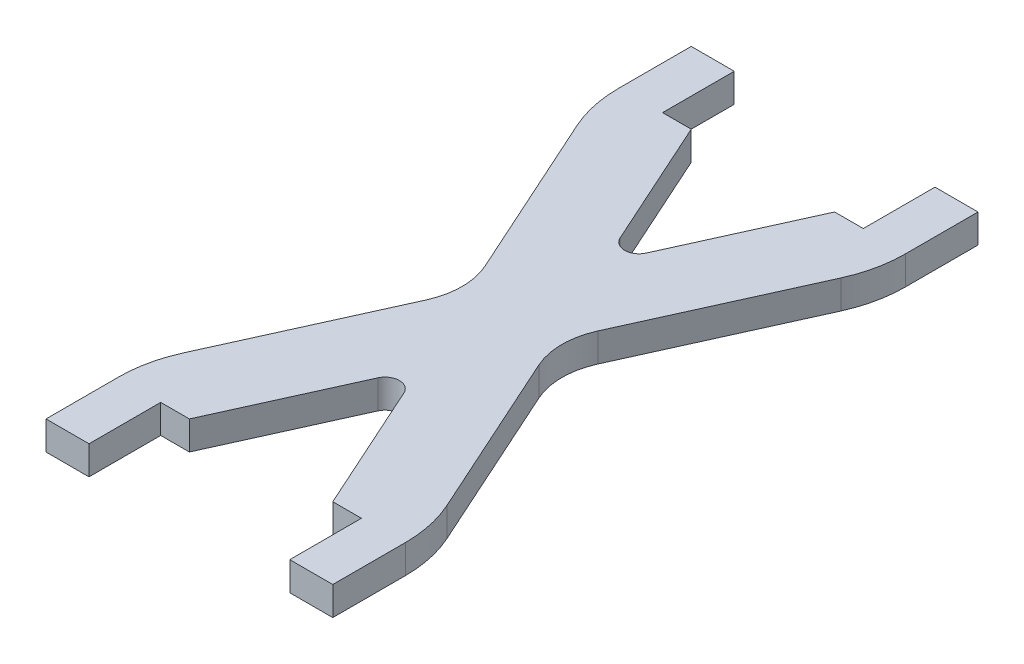
ISO-10303-21;
HEADER;
FILE_DESCRIPTION(('STEP AP214'),'2;1');
FILE_NAME('part.step','',(''),(''),'','','');
FILE_SCHEMA(('AUTOMOTIVE_DESIGN { 1 0 10303 214 1 1 1 1 }'));
ENDSEC;
DATA;
#1=APPLICATION_CONTEXT('core data for automotive mechanical design processes');
#2=APPLICATION_PROTOCOL_DEFINITION('international standard','automotive_design',2000,#1);
#3=PRODUCT_CONTEXT('',#1,'mechanical');
#4=PRODUCT('Part','Part','',(#3));
#5=PRODUCT_RELATED_PRODUCT_CATEGORY('part','',(#4));
#6=PRODUCT_DEFINITION_FORMATION('','',#4);
#7=PRODUCT_DEFINITION_CONTEXT('part definition',#1,'design');
#8=PRODUCT_DEFINITION('design','',#6,#7);
#9=PRODUCT_DEFINITION_SHAPE('','',#8);
#10=(LENGTH_UNIT() NAMED_UNIT(*) SI_UNIT(.MILLI.,.METRE.));
#11=(NAMED_UNIT(*) PLANE_ANGLE_UNIT() SI_UNIT($,.RADIAN.));
#12=(NAMED_UNIT(*) SI_UNIT($,.STERADIAN.) SOLID_ANGLE_UNIT());
#13=UNCERTAINTY_MEASURE_WITH_UNIT(LENGTH_MEASURE(1.E-05),#10,'distance_accuracy_value','');
#14=(GEOMETRIC_REPRESENTATION_CONTEXT(3) GLOBAL_UNCERTAINTY_ASSIGNED_CONTEXT((#13)) GLOBAL_UNIT_ASSIGNED_CONTEXT((#10,
#11,#12)) REPRESENTATION_CONTEXT('',''));
#15=CARTESIAN_POINT('',(0.,0.,0.));
#16=DIRECTION('',(0.,0.,1.));
#17=DIRECTION('',(1.,0.,0.));
#18=AXIS2_PLACEMENT_3D('',#15,#16,#17);
#19=CARTESIAN_POINT('',(0.,2.,5.));
#20=DIRECTION('',(0.,0.,-1.));
#21=DIRECTION('',(-1.,0.,0.));
#22=AXIS2_PLACEMENT_3D('',#19,#20,#21);
#23=PLANE('',#22);
#24=DIRECTION('',(1.,0.,0.));
#25=VECTOR('',#24,1.);
#26=CARTESIAN_POINT('',(0.,0.,5.));
#27=LINE('',#26,#25);
#28=CARTESIAN_POINT('',(0.,0.,5.));
#29=VERTEX_POINT('',#28);
#30=CARTESIAN_POINT('',(3.,0.,5.));
#31=VERTEX_POINT('',#30);
#32=EDGE_CURVE('E446',#29,#31,#27,.T.);
#33=ORIENTED_EDGE('',*,*,#32,.T.);
#34=DIRECTION('',(0.,-1.,0.));
#35=VECTOR('',#34,1.);
#36=CARTESIAN_POINT('',(3.,2.,5.));
#37=LINE('',#36,#35);
#38=CARTESIAN_POINT('',(3.,2.,5.));
#39=VERTEX_POINT('',#38);
#40=EDGE_CURVE('E259',#39,#31,#37,.T.);
#41=ORIENTED_EDGE('',*,*,#40,.F.);
#42=DIRECTION('',(1.,0.,0.));
#43=VECTOR('',#42,1.);
#44=CARTESIAN_POINT('',(0.,2.,5.));
#45=LINE('',#44,#43);
#46=CARTESIAN_POINT('',(0.,2.,5.));
#47=VERTEX_POINT('',#46);
#48=EDGE_CURVE('E245',#47,#39,#45,.T.);
#49=ORIENTED_EDGE('',*,*,#48,.F.);
#50=DIRECTION('',(0.,-1.,0.));
#51=VECTOR('',#50,1.);
#52=CARTESIAN_POINT('',(0.,2.,5.));
#53=LINE('',#52,#51);
#54=EDGE_CURVE('E257',#47,#29,#53,.T.);
#55=ORIENTED_EDGE('',*,*,#54,.T.);
#56=EDGE_LOOP('',(#33,#41,#49,#55));
#57=FACE_BOUND('',#56,.T.);
#58=ADVANCED_FACE('F33',(#57),#23,.F.);
#59=CARTESIAN_POINT('',(3.,2.,0.));
#60=DIRECTION('',(-1.,0.,0.));
#61=DIRECTION('',(0.,0.,1.));
#62=AXIS2_PLACEMENT_3D('',#59,#60,#61);
#63=PLANE('',#62);
#64=DIRECTION('',(0.,0.,-1.));
#65=VECTOR('',#64,1.);
#66=CARTESIAN_POINT('',(3.,0.,0.));
#67=LINE('',#66,#65);
#68=CARTESIAN_POINT('',(3.,0.,0.));
#69=VERTEX_POINT('',#68);
#70=EDGE_CURVE('E440',#31,#69,#67,.T.);
#71=ORIENTED_EDGE('',*,*,#70,.T.);
#72=DIRECTION('',(0.,-1.,0.));
#73=VECTOR('',#72,1.);
#74=CARTESIAN_POINT('',(3.,2.,0.));
#75=LINE('',#74,#73);
#76=CARTESIAN_POINT('',(3.,2.,0.));
#77=VERTEX_POINT('',#76);
#78=EDGE_CURVE('E271',#77,#69,#75,.T.);
#79=ORIENTED_EDGE('',*,*,#78,.F.);
#80=DIRECTION('',(0.,0.,-1.));
#81=VECTOR('',#80,1.);
#82=CARTESIAN_POINT('',(3.,2.,0.));
#83=LINE('',#82,#81);
#84=EDGE_CURVE('E261',#39,#77,#83,.T.);
#85=ORIENTED_EDGE('',*,*,#84,.F.);
#86=ORIENTED_EDGE('',*,*,#40,.T.);
#87=EDGE_LOOP('',(#71,#79,#85,#86));
#88=FACE_BOUND('',#87,.T.);
#89=ADVANCED_FACE('F501',(#88),#63,.F.);
#90=CARTESIAN_POINT('',(3.,2.,0.));
#91=DIRECTION('',(0.,0.,-1.));
#92=DIRECTION('',(-1.,0.,0.));
#93=AXIS2_PLACEMENT_3D('',#90,#91,#92);
#94=PLANE('',#93);
#95=DIRECTION('',(1.,0.,0.));
#96=VECTOR('',#95,1.);
#97=CARTESIAN_POINT('',(3.,0.,0.));
#98=LINE('',#97,#96);
#99=CARTESIAN_POINT('',(5.,0.,0.));
#100=VERTEX_POINT('',#99);
#101=EDGE_CURVE('E435',#69,#100,#98,.T.);
#102=ORIENTED_EDGE('',*,*,#101,.T.);
#103=DIRECTION('',(0.,-1.,0.));
#104=VECTOR('',#103,1.);
#105=CARTESIAN_POINT('',(5.,2.,0.));
#106=LINE('',#105,#104);
#107=CARTESIAN_POINT('',(5.,2.,0.));
#108=VERTEX_POINT('',#107);
#109=EDGE_CURVE('E426',#108,#100,#106,.T.);
#110=ORIENTED_EDGE('',*,*,#109,.F.);
#111=DIRECTION('',(1.,0.,0.));
#112=VECTOR('',#111,1.);
#113=CARTESIAN_POINT('',(3.,2.,0.));
#114=LINE('',#113,#112);
#115=EDGE_CURVE('E436',#77,#108,#114,.T.);
#116=ORIENTED_EDGE('',*,*,#115,.F.);
#117=ORIENTED_EDGE('',*,*,#78,.T.);
#118=EDGE_LOOP('',(#102,#110,#116,#117));
#119=FACE_BOUND('',#118,.T.);
#120=ADVANCED_FACE('F433',(#119),#94,.F.);
#121=CARTESIAN_POINT('',(5.,2.,0.));
#122=DIRECTION('',(-0.911370599658675,0.,-0.411586722426499));
#123=DIRECTION('',(-0.411586722426499,0.,0.911370599658675));
#124=AXIS2_PLACEMENT_3D('',#121,#122,#123);
#125=PLANE('',#124);
#126=DIRECTION('',(0.411586722426499,0.,-0.911370599658675));
#127=VECTOR('',#126,1.);
#128=CARTESIAN_POINT('',(5.,0.,0.));
#129=LINE('',#128,#127);
#130=CARTESIAN_POINT('',(9.08862940034133,0.,-9.05339367218436));
#131=VERTEX_POINT('',#130);
#132=EDGE_CURVE('E442',#100,#131,#129,.T.);
#133=ORIENTED_EDGE('',*,*,#132,.T.);
#134=DIRECTION('',(0.,-1.,0.));
#135=VECTOR('',#134,1.);
#136=CARTESIAN_POINT('',(9.08862940034133,2.,-9.05339367218436));
#137=LINE('',#136,#135);
#138=CARTESIAN_POINT('',(9.08862940034133,2.,-9.05339367218436));
#139=VERTEX_POINT('',#138);
#140=EDGE_CURVE('E269',#131,#139,#137,.F.);
#141=ORIENTED_EDGE('',*,*,#140,.T.);
#142=DIRECTION('',(0.411586722426499,0.,-0.911370599658675));
#143=VECTOR('',#142,1.);
#144=CARTESIAN_POINT('',(5.,2.,0.));
#145=LINE('',#144,#143);
#146=EDGE_CURVE('E503',#108,#139,#145,.T.);
#147=ORIENTED_EDGE('',*,*,#146,.F.);
#148=ORIENTED_EDGE('',*,*,#109,.T.);
#149=EDGE_LOOP('',(#133,#141,#147,#148));
#150=FACE_BOUND('',#149,.T.);
#151=ADVANCED_FACE('F530',(#150),#125,.F.);
#152=CARTESIAN_POINT('',(15.,2.,0.));
#153=DIRECTION('',(0.911370599658675,0.,-0.411586722426499));
#154=DIRECTION('',(-0.411586722426499,0.,-0.911370599658675));
#155=AXIS2_PLACEMENT_3D('',#152,#153,#154);
#156=PLANE('',#155);
#157=DIRECTION('',(0.411586722426499,0.,0.911370599658675));
#158=VECTOR('',#157,1.);
#159=CARTESIAN_POINT('',(15.,2.,0.));
#160=LINE('',#159,#158);
#161=CARTESIAN_POINT('',(10.9113705996587,2.,-9.05339367218436));
#162=VERTEX_POINT('',#161);
#163=CARTESIAN_POINT('',(15.,2.,0.));
#164=VERTEX_POINT('',#163);
#165=EDGE_CURVE('E508',#162,#164,#160,.T.);
#166=ORIENTED_EDGE('',*,*,#165,.F.);
#167=DIRECTION('',(0.,-1.,0.));
#168=VECTOR('',#167,1.);
#169=CARTESIAN_POINT('',(10.9113705996587,0.,-9.05339367218436));
#170=LINE('',#169,#168);
#171=CARTESIAN_POINT('',(10.9113705996587,0.,-9.05339367218436));
#172=VERTEX_POINT('',#171);
#173=EDGE_CURVE('E266',#162,#172,#170,.T.);
#174=ORIENTED_EDGE('',*,*,#173,.T.);
#175=DIRECTION('',(0.411586722426499,0.,0.911370599658675));
#176=VECTOR('',#175,1.);
#177=CARTESIAN_POINT('',(15.,0.,0.));
#178=LINE('',#177,#176);
#179=CARTESIAN_POINT('',(15.,0.,0.));
#180=VERTEX_POINT('',#179);
#181=EDGE_CURVE('E444',#172,#180,#178,.T.);
#182=ORIENTED_EDGE('',*,*,#181,.T.);
#183=DIRECTION('',(0.,-1.,0.));
#184=VECTOR('',#183,1.);
#185=CARTESIAN_POINT('',(15.,2.,0.));
#186=LINE('',#185,#184);
#187=EDGE_CURVE('E423',#164,#180,#186,.T.);
#188=ORIENTED_EDGE('',*,*,#187,.F.);
#189=EDGE_LOOP('',(#166,#174,#182,#188));
#190=FACE_BOUND('',#189,.T.);
#191=ADVANCED_FACE('F523',(#190),#156,.F.);
#192=CARTESIAN_POINT('',(15.,2.,0.));
#193=DIRECTION('',(0.,0.,-1.));
#194=DIRECTION('',(-1.,0.,0.));
#195=AXIS2_PLACEMENT_3D('',#192,#193,#194);
#196=PLANE('',#195);
#197=DIRECTION('',(1.,0.,0.));
#198=VECTOR('',#197,1.);
#199=CARTESIAN_POINT('',(15.,0.,0.));
#200=LINE('',#199,#198);
#201=CARTESIAN_POINT('',(17.,0.,0.));
#202=VERTEX_POINT('',#201);
#203=EDGE_CURVE('E451',#180,#202,#200,.T.);
#204=ORIENTED_EDGE('',*,*,#203,.T.);
#205=DIRECTION('',(0.,-1.,0.));
#206=VECTOR('',#205,1.);
#207=CARTESIAN_POINT('',(17.,2.,0.));
#208=LINE('',#207,#206);
#209=CARTESIAN_POINT('',(17.,2.,0.));
#210=VERTEX_POINT('',#209);
#211=EDGE_CURVE('E420',#210,#202,#208,.T.);
#212=ORIENTED_EDGE('',*,*,#211,.F.);
#213=DIRECTION('',(1.,0.,0.));
#214=VECTOR('',#213,1.);
#215=CARTESIAN_POINT('',(15.,2.,0.));
#216=LINE('',#215,#214);
#217=EDGE_CURVE('E510',#164,#210,#216,.T.);
#218=ORIENTED_EDGE('',*,*,#217,.F.);
#219=ORIENTED_EDGE('',*,*,#187,.T.);
#220=EDGE_LOOP('',(#204,#212,#218,#219));
#221=FACE_BOUND('',#220,.T.);
#222=ADVANCED_FACE('F519',(#221),#196,.F.);
#223=CARTESIAN_POINT('',(17.,2.,0.));
#224=DIRECTION('',(1.,0.,0.));
#225=DIRECTION('',(0.,0.,-1.));
#226=AXIS2_PLACEMENT_3D('',#223,#224,#225);
#227=PLANE('',#226);
#228=DIRECTION('',(0.,0.,1.));
#229=VECTOR('',#228,1.);
#230=CARTESIAN_POINT('',(17.,0.,0.));
#231=LINE('',#230,#229);
#232=CARTESIAN_POINT('',(17.,0.,5.));
#233=VERTEX_POINT('',#232);
#234=EDGE_CURVE('E453',#202,#233,#231,.T.);
#235=ORIENTED_EDGE('',*,*,#234,.T.);
#236=DIRECTION('',(0.,-1.,0.));
#237=VECTOR('',#236,1.);
#238=CARTESIAN_POINT('',(17.,2.,5.));
#239=LINE('',#238,#237);
#240=CARTESIAN_POINT('',(17.,2.,5.));
#241=VERTEX_POINT('',#240);
#242=EDGE_CURVE('E417',#241,#233,#239,.T.);
#243=ORIENTED_EDGE('',*,*,#242,.F.);
#244=DIRECTION('',(0.,0.,1.));
#245=VECTOR('',#244,1.);
#246=CARTESIAN_POINT('',(17.,2.,0.));
#247=LINE('',#246,#245);
#248=EDGE_CURVE('E472',#210,#241,#247,.T.);
#249=ORIENTED_EDGE('',*,*,#248,.F.);
#250=ORIENTED_EDGE('',*,*,#211,.T.);
#251=EDGE_LOOP('',(#235,#243,#249,#250));
#252=FACE_BOUND('',#251,.T.);
#253=ADVANCED_FACE('F515',(#252),#227,.F.);
#254=CARTESIAN_POINT('',(20.,2.,5.));
#255=DIRECTION('',(0.,0.,-1.));
#256=DIRECTION('',(-1.,0.,0.));
#257=AXIS2_PLACEMENT_3D('',#254,#255,#256);
#258=PLANE('',#257);
#259=DIRECTION('',(1.,0.,0.));
#260=VECTOR('',#259,1.);
#261=CARTESIAN_POINT('',(20.,0.,5.));
#262=LINE('',#261,#260);
#263=CARTESIAN_POINT('',(20.,0.,5.));
#264=VERTEX_POINT('',#263);
#265=EDGE_CURVE('E358',#233,#264,#262,.T.);
#266=ORIENTED_EDGE('',*,*,#265,.T.);
#267=DIRECTION('',(0.,-1.,0.));
#268=VECTOR('',#267,1.);
#269=CARTESIAN_POINT('',(20.,2.,5.));
#270=LINE('',#269,#268);
#271=CARTESIAN_POINT('',(20.,2.,5.));
#272=VERTEX_POINT('',#271);
#273=EDGE_CURVE('E414',#272,#264,#270,.T.);
#274=ORIENTED_EDGE('',*,*,#273,.F.);
#275=DIRECTION('',(1.,0.,0.));
#276=VECTOR('',#275,1.);
#277=CARTESIAN_POINT('',(20.,2.,5.));
#278=LINE('',#277,#276);
#279=EDGE_CURVE('E468',#241,#272,#278,.T.);
#280=ORIENTED_EDGE('',*,*,#279,.F.);
#281=ORIENTED_EDGE('',*,*,#242,.T.);
#282=EDGE_LOOP('',(#266,#274,#280,#281));
#283=FACE_BOUND('',#282,.T.);
#284=ADVANCED_FACE('F458',(#283),#258,.F.);
#285=CARTESIAN_POINT('',(20.,2.,0.));
#286=DIRECTION('',(-1.,0.,0.));
#287=DIRECTION('',(0.,0.,1.));
#288=AXIS2_PLACEMENT_3D('',#285,#286,#287);
#289=PLANE('',#288);
#290=DIRECTION('',(0.,0.,-1.));
#291=VECTOR('',#290,1.);
#292=CARTESIAN_POINT('',(20.,0.,0.));
#293=LINE('',#292,#291);
#294=CARTESIAN_POINT('',(20.,0.,-0.0619768335350678));
#295=VERTEX_POINT('',#294);
#296=EDGE_CURVE('E353',#264,#295,#293,.T.);
#297=ORIENTED_EDGE('',*,*,#296,.T.);
#298=DIRECTION('',(0.,-1.,0.));
#299=VECTOR('',#298,1.);
#300=CARTESIAN_POINT('',(20.,2.,-0.0619768335350678));
#301=LINE('',#300,#299);
#302=CARTESIAN_POINT('',(20.,2.,-0.0619768335350678));
#303=VERTEX_POINT('',#302);
#304=EDGE_CURVE('E11',#295,#303,#301,.F.);
#305=ORIENTED_EDGE('',*,*,#304,.T.);
#306=DIRECTION('',(0.,0.,-1.));
#307=VECTOR('',#306,1.);
#308=CARTESIAN_POINT('',(20.,2.,0.));
#309=LINE('',#308,#307);
#310=EDGE_CURVE('E467',#272,#303,#309,.T.);
#311=ORIENTED_EDGE('',*,*,#310,.F.);
#312=ORIENTED_EDGE('',*,*,#273,.T.);
#313=EDGE_LOOP('',(#297,#305,#311,#312));
#314=FACE_BOUND('',#313,.T.);
#315=ADVANCED_FACE('F464',(#314),#289,.F.);
#316=CARTESIAN_POINT('',(20.,2.,-2.));
#317=DIRECTION('',(-0.911370599658675,0.,0.411586722426498));
#318=DIRECTION('',(0.411586722426498,0.,0.911370599658675));
#319=AXIS2_PLACEMENT_3D('',#316,#317,#318);
#320=PLANE('',#319);
#321=DIRECTION('',(-0.411586722426498,0.,-0.911370599658675));
#322=VECTOR('',#321,1.);
#323=CARTESIAN_POINT('',(20.,2.,-2.));
#324=LINE('',#323,#322);
#325=CARTESIAN_POINT('',(19.2023353969281,2.,-3.76625733537355));
#326=VERTEX_POINT('',#325);
#327=CARTESIAN_POINT('',(13.9293893732211,2.,-15.4420663878675));
#328=VERTEX_POINT('',#327);
#329=EDGE_CURVE('E344',#326,#328,#324,.T.);
#330=ORIENTED_EDGE('',*,*,#329,.F.);
#331=DIRECTION('',(0.,-1.,0.));
#332=VECTOR('',#331,1.);
#333=CARTESIAN_POINT('',(19.2023353969281,2.,-3.76625733537355));
#334=LINE('',#333,#332);
#335=CARTESIAN_POINT('',(19.2023353969281,0.,-3.76625733537355));
#336=VERTEX_POINT('',#335);
#337=EDGE_CURVE('E41',#326,#336,#334,.T.);
#338=ORIENTED_EDGE('',*,*,#337,.T.);
#339=DIRECTION('',(-0.411586722426498,0.,-0.911370599658675));
#340=VECTOR('',#339,1.);
#341=CARTESIAN_POINT('',(20.,0.,-2.));
#342=LINE('',#341,#340);
#343=CARTESIAN_POINT('',(13.9293893732211,0.,-15.4420663878675));
#344=VERTEX_POINT('',#343);
#345=EDGE_CURVE('E343',#336,#344,#342,.T.);
#346=ORIENTED_EDGE('',*,*,#345,.T.);
#347=DIRECTION('',(0.,-1.,0.));
#348=VECTOR('',#347,1.);
#349=CARTESIAN_POINT('',(13.9293893732211,2.,-15.4420663878675));
#350=LINE('',#349,#348);
#351=EDGE_CURVE('E298',#344,#328,#350,.F.);
#352=ORIENTED_EDGE('',*,*,#351,.T.);
#353=EDGE_LOOP('',(#330,#338,#346,#352));
#354=FACE_BOUND('',#353,.T.);
#355=ADVANCED_FACE('F342',(#354),#320,.F.);
#356=CARTESIAN_POINT('',(20.,2.,-33.));
#357=DIRECTION('',(-0.911370599658675,0.,-0.411586722426498));
#358=DIRECTION('',(-0.411586722426498,0.,0.911370599658675));
#359=AXIS2_PLACEMENT_3D('',#356,#357,#358);
#360=PLANE('',#359);
#361=DIRECTION('',(0.411586722426498,0.,-0.911370599658675));
#362=VECTOR('',#361,1.);
#363=CARTESIAN_POINT('',(20.,0.,-33.));
#364=LINE('',#363,#362);
#365=CARTESIAN_POINT('',(13.9293893732211,0.,-19.5579336121325));
#366=VERTEX_POINT('',#365);
#367=CARTESIAN_POINT('',(19.2023353969281,0.,-31.2337426646264));
#368=VERTEX_POINT('',#367);
#369=EDGE_CURVE('E352',#366,#368,#364,.T.);
#370=ORIENTED_EDGE('',*,*,#369,.T.);
#371=DIRECTION('',(0.,-1.,0.));
#372=VECTOR('',#371,1.);
#373=CARTESIAN_POINT('',(19.2023353969281,2.,-31.2337426646264));
#374=LINE('',#373,#372);
#375=CARTESIAN_POINT('',(19.2023353969281,2.,-31.2337426646264));
#376=VERTEX_POINT('',#375);
#377=EDGE_CURVE('E336',#368,#376,#374,.F.);
#378=ORIENTED_EDGE('',*,*,#377,.T.);
#379=DIRECTION('',(0.411586722426498,0.,-0.911370599658675));
#380=VECTOR('',#379,1.);
#381=CARTESIAN_POINT('',(20.,2.,-33.));
#382=LINE('',#381,#380);
#383=CARTESIAN_POINT('',(13.9293893732211,2.,-19.5579336121325));
#384=VERTEX_POINT('',#383);
#385=EDGE_CURVE('E470',#384,#376,#382,.T.);
#386=ORIENTED_EDGE('',*,*,#385,.F.);
#387=DIRECTION('',(0.,-1.,0.));
#388=VECTOR('',#387,1.);
#389=CARTESIAN_POINT('',(13.9293893732211,0.,-19.5579336121325));
#390=LINE('',#389,#388);
#391=EDGE_CURVE('E295',#384,#366,#390,.T.);
#392=ORIENTED_EDGE('',*,*,#391,.T.);
#393=EDGE_LOOP('',(#370,#378,#386,#392));
#394=FACE_BOUND('',#393,.T.);
#395=ADVANCED_FACE('F655',(#394),#360,.F.);
#396=CARTESIAN_POINT('',(20.,2.,-35.));
#397=DIRECTION('',(-1.,0.,0.));
#398=DIRECTION('',(0.,0.,1.));
#399=AXIS2_PLACEMENT_3D('',#396,#397,#398);
#400=PLANE('',#399);
#401=DIRECTION('',(0.,0.,-1.));
#402=VECTOR('',#401,1.);
#403=CARTESIAN_POINT('',(20.,2.,-33.));
#404=LINE('',#403,#402);
#405=CARTESIAN_POINT('',(20.,2.,-34.9380231664649));
#406=VERTEX_POINT('',#405);
#407=CARTESIAN_POINT('',(20.,2.,-40.));
#408=VERTEX_POINT('',#407);
#409=EDGE_CURVE('E478',#406,#408,#404,.T.);
#410=ORIENTED_EDGE('',*,*,#409,.F.);
#411=DIRECTION('',(0.,-1.,0.));
#412=VECTOR('',#411,1.);
#413=CARTESIAN_POINT('',(20.,2.,-34.9380231664649));
#414=LINE('',#413,#412);
#415=CARTESIAN_POINT('',(20.,0.,-34.9380231664649));
#416=VERTEX_POINT('',#415);
#417=EDGE_CURVE('E333',#406,#416,#414,.T.);
#418=ORIENTED_EDGE('',*,*,#417,.T.);
#419=DIRECTION('',(0.,0.,-1.));
#420=VECTOR('',#419,1.);
#421=CARTESIAN_POINT('',(20.,0.,-35.));
#422=LINE('',#421,#420);
#423=CARTESIAN_POINT('',(20.,0.,-40.));
#424=VERTEX_POINT('',#423);
#425=EDGE_CURVE('E356',#416,#424,#422,.T.);
#426=ORIENTED_EDGE('',*,*,#425,.T.);
#427=DIRECTION('',(0.,-1.,0.));
#428=VECTOR('',#427,1.);
#429=CARTESIAN_POINT('',(20.,2.,-40.));
#430=LINE('',#429,#428);
#431=EDGE_CURVE('E411',#408,#424,#430,.T.);
#432=ORIENTED_EDGE('',*,*,#431,.F.);
#433=EDGE_LOOP('',(#410,#418,#426,#432));
#434=FACE_BOUND('',#433,.T.);
#435=ADVANCED_FACE('F581',(#434),#400,.F.);
#436=CARTESIAN_POINT('',(20.,2.,-40.));
#437=DIRECTION('',(0.,0.,1.));
#438=DIRECTION('',(1.,0.,0.));
#439=AXIS2_PLACEMENT_3D('',#436,#437,#438);
#440=PLANE('',#439);
#441=DIRECTION('',(-1.,0.,0.));
#442=VECTOR('',#441,1.);
#443=CARTESIAN_POINT('',(20.,0.,-40.));
#444=LINE('',#443,#442);
#445=CARTESIAN_POINT('',(17.,0.,-40.));
#446=VERTEX_POINT('',#445);
#447=EDGE_CURVE('E363',#424,#446,#444,.T.);
#448=ORIENTED_EDGE('',*,*,#447,.T.);
#449=DIRECTION('',(0.,-1.,0.));
#450=VECTOR('',#449,1.);
#451=CARTESIAN_POINT('',(17.,2.,-40.));
#452=LINE('',#451,#450);
#453=CARTESIAN_POINT('',(17.,2.,-40.));
#454=VERTEX_POINT('',#453);
#455=EDGE_CURVE('E408',#454,#446,#452,.T.);
#456=ORIENTED_EDGE('',*,*,#455,.F.);
#457=DIRECTION('',(-1.,0.,0.));
#458=VECTOR('',#457,1.);
#459=CARTESIAN_POINT('',(20.,2.,-40.));
#460=LINE('',#459,#458);
#461=EDGE_CURVE('E480',#408,#454,#460,.T.);
#462=ORIENTED_EDGE('',*,*,#461,.F.);
#463=ORIENTED_EDGE('',*,*,#431,.T.);
#464=EDGE_LOOP('',(#448,#456,#462,#463));
#465=FACE_BOUND('',#464,.T.);
#466=ADVANCED_FACE('F587',(#465),#440,.F.);
#467=CARTESIAN_POINT('',(17.,2.,-35.));
#468=DIRECTION('',(1.,0.,0.));
#469=DIRECTION('',(0.,0.,-1.));
#470=AXIS2_PLACEMENT_3D('',#467,#468,#469);
#471=PLANE('',#470);
#472=DIRECTION('',(0.,0.,1.));
#473=VECTOR('',#472,1.);
#474=CARTESIAN_POINT('',(17.,0.,-35.));
#475=LINE('',#474,#473);
#476=CARTESIAN_POINT('',(17.,0.,-35.));
#477=VERTEX_POINT('',#476);
#478=EDGE_CURVE('E365',#446,#477,#475,.T.);
#479=ORIENTED_EDGE('',*,*,#478,.T.);
#480=DIRECTION('',(0.,-1.,0.));
#481=VECTOR('',#480,1.);
#482=CARTESIAN_POINT('',(17.,2.,-35.));
#483=LINE('',#482,#481);
#484=CARTESIAN_POINT('',(17.,2.,-35.));
#485=VERTEX_POINT('',#484);
#486=EDGE_CURVE('E405',#485,#477,#483,.T.);
#487=ORIENTED_EDGE('',*,*,#486,.F.);
#488=DIRECTION('',(0.,0.,1.));
#489=VECTOR('',#488,1.);
#490=CARTESIAN_POINT('',(17.,2.,-35.));
#491=LINE('',#490,#489);
#492=EDGE_CURVE('E482',#454,#485,#491,.T.);
#493=ORIENTED_EDGE('',*,*,#492,.F.);
#494=ORIENTED_EDGE('',*,*,#455,.T.);
#495=EDGE_LOOP('',(#479,#487,#493,#494));
#496=FACE_BOUND('',#495,.T.);
#497=ADVANCED_FACE('F593',(#496),#471,.F.);
#498=CARTESIAN_POINT('',(15.,2.,-35.));
#499=DIRECTION('',(0.,0.,1.));
#500=DIRECTION('',(1.,0.,0.));
#501=AXIS2_PLACEMENT_3D('',#498,#499,#500);
#502=PLANE('',#501);
#503=DIRECTION('',(-1.,0.,0.));
#504=VECTOR('',#503,1.);
#505=CARTESIAN_POINT('',(15.,0.,-35.));
#506=LINE('',#505,#504);
#507=CARTESIAN_POINT('',(15.,0.,-35.));
#508=VERTEX_POINT('',#507);
#509=EDGE_CURVE('E367',#477,#508,#506,.T.);
#510=ORIENTED_EDGE('',*,*,#509,.T.);
#511=DIRECTION('',(0.,-1.,0.));
#512=VECTOR('',#511,1.);
#513=CARTESIAN_POINT('',(15.,2.,-35.));
#514=LINE('',#513,#512);
#515=CARTESIAN_POINT('',(15.,2.,-35.));
#516=VERTEX_POINT('',#515);
#517=EDGE_CURVE('E402',#516,#508,#514,.T.);
#518=ORIENTED_EDGE('',*,*,#517,.F.);
#519=DIRECTION('',(-1.,0.,0.));
#520=VECTOR('',#519,1.);
#521=CARTESIAN_POINT('',(15.,2.,-35.));
#522=LINE('',#521,#520);
#523=EDGE_CURVE('E484',#485,#516,#522,.T.);
#524=ORIENTED_EDGE('',*,*,#523,.F.);
#525=ORIENTED_EDGE('',*,*,#486,.T.);
#526=EDGE_LOOP('',(#510,#518,#524,#525));
#527=FACE_BOUND('',#526,.T.);
#528=ADVANCED_FACE('F597',(#527),#502,.F.);
#529=CARTESIAN_POINT('',(15.,2.,-35.));
#530=DIRECTION('',(0.911370599658675,0.,0.411586722426499));
#531=DIRECTION('',(0.411586722426499,0.,-0.911370599658675));
#532=AXIS2_PLACEMENT_3D('',#529,#530,#531);
#533=PLANE('',#532);
#534=DIRECTION('',(-0.411586722426499,0.,0.911370599658675));
#535=VECTOR('',#534,1.);
#536=CARTESIAN_POINT('',(15.,0.,-35.));
#537=LINE('',#536,#535);
#538=CARTESIAN_POINT('',(10.9113705996587,0.,-25.9466063278156));
#539=VERTEX_POINT('',#538);
#540=EDGE_CURVE('E369',#508,#539,#537,.T.);
#541=ORIENTED_EDGE('',*,*,#540,.T.);
#542=DIRECTION('',(0.,-1.,0.));
#543=VECTOR('',#542,1.);
#544=CARTESIAN_POINT('',(10.9113705996587,2.,-25.9466063278156));
#545=LINE('',#544,#543);
#546=CARTESIAN_POINT('',(10.9113705996587,2.,-25.9466063278156));
#547=VERTEX_POINT('',#546);
#548=EDGE_CURVE('E279',#539,#547,#545,.F.);
#549=ORIENTED_EDGE('',*,*,#548,.T.);
#550=DIRECTION('',(-0.411586722426499,0.,0.911370599658675));
#551=VECTOR('',#550,1.);
#552=CARTESIAN_POINT('',(15.,2.,-35.));
#553=LINE('',#552,#551);
#554=EDGE_CURVE('E486',#516,#547,#553,.T.);
#555=ORIENTED_EDGE('',*,*,#554,.F.);
#556=ORIENTED_EDGE('',*,*,#517,.T.);
#557=EDGE_LOOP('',(#541,#549,#555,#556));
#558=FACE_BOUND('',#557,.T.);
#559=ADVANCED_FACE('F601',(#558),#533,.F.);
#560=CARTESIAN_POINT('',(5.,2.,-35.));
#561=DIRECTION('',(-0.911370599658675,0.,0.411586722426499));
#562=DIRECTION('',(0.411586722426499,0.,0.911370599658675));
#563=AXIS2_PLACEMENT_3D('',#560,#561,#562);
#564=PLANE('',#563);
#565=DIRECTION('',(-0.411586722426499,0.,-0.911370599658675));
#566=VECTOR('',#565,1.);
#567=CARTESIAN_POINT('',(5.,2.,-35.));
#568=LINE('',#567,#566);
#569=CARTESIAN_POINT('',(9.08862940034133,2.,-25.9466063278156));
#570=VERTEX_POINT('',#569);
#571=CARTESIAN_POINT('',(5.,2.,-35.));
#572=VERTEX_POINT('',#571);
#573=EDGE_CURVE('E489',#570,#572,#568,.T.);
#574=ORIENTED_EDGE('',*,*,#573,.F.);
#575=DIRECTION('',(0.,-1.,0.));
#576=VECTOR('',#575,1.);
#577=CARTESIAN_POINT('',(9.08862940034132,0.,-25.9466063278156));
#578=LINE('',#577,#576);
#579=CARTESIAN_POINT('',(9.08862940034133,0.,-25.9466063278156));
#580=VERTEX_POINT('',#579);
#581=EDGE_CURVE('E276',#570,#580,#578,.T.);
#582=ORIENTED_EDGE('',*,*,#581,.T.);
#583=DIRECTION('',(-0.411586722426499,0.,-0.911370599658675));
#584=VECTOR('',#583,1.);
#585=CARTESIAN_POINT('',(5.,0.,-35.));
#586=LINE('',#585,#584);
#587=CARTESIAN_POINT('',(5.,0.,-35.));
#588=VERTEX_POINT('',#587);
#589=EDGE_CURVE('E372',#580,#588,#586,.T.);
#590=ORIENTED_EDGE('',*,*,#589,.T.);
#591=DIRECTION('',(0.,-1.,0.));
#592=VECTOR('',#591,1.);
#593=CARTESIAN_POINT('',(5.,2.,-35.));
#594=LINE('',#593,#592);
#595=EDGE_CURVE('E399',#572,#588,#594,.T.);
#596=ORIENTED_EDGE('',*,*,#595,.F.);
#597=EDGE_LOOP('',(#574,#582,#590,#596));
#598=FACE_BOUND('',#597,.T.);
#599=ADVANCED_FACE('F608',(#598),#564,.F.);
#600=CARTESIAN_POINT('',(3.,2.,-35.));
#601=DIRECTION('',(0.,0.,1.));
#602=DIRECTION('',(1.,0.,0.));
#603=AXIS2_PLACEMENT_3D('',#600,#601,#602);
#604=PLANE('',#603);
#605=DIRECTION('',(-1.,0.,0.));
#606=VECTOR('',#605,1.);
#607=CARTESIAN_POINT('',(3.,0.,-35.));
#608=LINE('',#607,#606);
#609=CARTESIAN_POINT('',(3.,0.,-35.));
#610=VERTEX_POINT('',#609);
#611=EDGE_CURVE('E374',#588,#610,#608,.T.);
#612=ORIENTED_EDGE('',*,*,#611,.T.);
#613=DIRECTION('',(0.,-1.,0.));
#614=VECTOR('',#613,1.);
#615=CARTESIAN_POINT('',(3.,2.,-35.));
#616=LINE('',#615,#614);
#617=CARTESIAN_POINT('',(3.,2.,-35.));
#618=VERTEX_POINT('',#617);
#619=EDGE_CURVE('E396',#618,#610,#616,.T.);
#620=ORIENTED_EDGE('',*,*,#619,.F.);
#621=DIRECTION('',(-1.,0.,0.));
#622=VECTOR('',#621,1.);
#623=CARTESIAN_POINT('',(3.,2.,-35.));
#624=LINE('',#623,#622);
#625=EDGE_CURVE('E491',#572,#618,#624,.T.);
#626=ORIENTED_EDGE('',*,*,#625,.F.);
#627=ORIENTED_EDGE('',*,*,#595,.T.);
#628=EDGE_LOOP('',(#612,#620,#626,#627));
#629=FACE_BOUND('',#628,.T.);
#630=ADVANCED_FACE('F615',(#629),#604,.F.);
#631=CARTESIAN_POINT('',(3.,2.,-35.));
#632=DIRECTION('',(-1.,0.,0.));
#633=DIRECTION('',(0.,0.,1.));
#634=AXIS2_PLACEMENT_3D('',#631,#632,#633);
#635=PLANE('',#634);
#636=DIRECTION('',(0.,0.,-1.));
#637=VECTOR('',#636,1.);
#638=CARTESIAN_POINT('',(3.,0.,-35.));
#639=LINE('',#638,#637);
#640=CARTESIAN_POINT('',(3.,0.,-40.));
#641=VERTEX_POINT('',#640);
#642=EDGE_CURVE('E376',#610,#641,#639,.T.);
#643=ORIENTED_EDGE('',*,*,#642,.T.);
#644=DIRECTION('',(0.,-1.,0.));
#645=VECTOR('',#644,1.);
#646=CARTESIAN_POINT('',(3.,2.,-40.));
#647=LINE('',#646,#645);
#648=CARTESIAN_POINT('',(3.,2.,-40.));
#649=VERTEX_POINT('',#648);
#650=EDGE_CURVE('E392',#649,#641,#647,.T.);
#651=ORIENTED_EDGE('',*,*,#650,.F.);
#652=DIRECTION('',(0.,0.,-1.));
#653=VECTOR('',#652,1.);
#654=CARTESIAN_POINT('',(3.,2.,-35.));
#655=LINE('',#654,#653);
#656=EDGE_CURVE('E493',#618,#649,#655,.T.);
#657=ORIENTED_EDGE('',*,*,#656,.F.);
#658=ORIENTED_EDGE('',*,*,#619,.T.);
#659=EDGE_LOOP('',(#643,#651,#657,#658));
#660=FACE_BOUND('',#659,.T.);
#661=ADVANCED_FACE('F619',(#660),#635,.F.);
#662=CARTESIAN_POINT('',(0.,2.,-40.));
#663=DIRECTION('',(0.,0.,1.));
#664=DIRECTION('',(1.,0.,0.));
#665=AXIS2_PLACEMENT_3D('',#662,#663,#664);
#666=PLANE('',#665);
#667=DIRECTION('',(-1.,0.,0.));
#668=VECTOR('',#667,1.);
#669=CARTESIAN_POINT('',(0.,0.,-40.));
#670=LINE('',#669,#668);
#671=CARTESIAN_POINT('',(0.,0.,-40.));
#672=VERTEX_POINT('',#671);
#673=EDGE_CURVE('E378',#641,#672,#670,.T.);
#674=ORIENTED_EDGE('',*,*,#673,.T.);
#675=DIRECTION('',(0.,-1.,0.));
#676=VECTOR('',#675,1.);
#677=CARTESIAN_POINT('',(0.,2.,-40.));
#678=LINE('',#677,#676);
#679=CARTESIAN_POINT('',(0.,2.,-40.));
#680=VERTEX_POINT('',#679);
#681=EDGE_CURVE('E389',#680,#672,#678,.T.);
#682=ORIENTED_EDGE('',*,*,#681,.F.);
#683=DIRECTION('',(-1.,0.,0.));
#684=VECTOR('',#683,1.);
#685=CARTESIAN_POINT('',(0.,2.,-40.));
#686=LINE('',#685,#684);
#687=EDGE_CURVE('E495',#649,#680,#686,.T.);
#688=ORIENTED_EDGE('',*,*,#687,.F.);
#689=ORIENTED_EDGE('',*,*,#650,.T.);
#690=EDGE_LOOP('',(#674,#682,#688,#689));
#691=FACE_BOUND('',#690,.T.);
#692=ADVANCED_FACE('F624',(#691),#666,.F.);
#693=CARTESIAN_POINT('',(0.,2.,-33.));
#694=DIRECTION('',(1.,0.,0.));
#695=DIRECTION('',(0.,0.,-1.));
#696=AXIS2_PLACEMENT_3D('',#693,#694,#695);
#697=PLANE('',#696);
#698=DIRECTION('',(0.,0.,1.));
#699=VECTOR('',#698,1.);
#700=CARTESIAN_POINT('',(0.,0.,-33.));
#701=LINE('',#700,#699);
#702=CARTESIAN_POINT('',(0.,0.,-34.9380231664649));
#703=VERTEX_POINT('',#702);
#704=EDGE_CURVE('E381',#672,#703,#701,.T.);
#705=ORIENTED_EDGE('',*,*,#704,.T.);
#706=DIRECTION('',(0.,-1.,0.));
#707=VECTOR('',#706,1.);
#708=CARTESIAN_POINT('',(0.,2.,-34.9380231664649));
#709=LINE('',#708,#707);
#710=CARTESIAN_POINT('',(0.,2.,-34.9380231664649));
#711=VERTEX_POINT('',#710);
#712=EDGE_CURVE('E56',#703,#711,#709,.F.);
#713=ORIENTED_EDGE('',*,*,#712,.T.);
#714=DIRECTION('',(0.,0.,1.));
#715=VECTOR('',#714,1.);
#716=CARTESIAN_POINT('',(0.,2.,-35.));
#717=LINE('',#716,#715);
#718=EDGE_CURVE('E497',#680,#711,#717,.T.);
#719=ORIENTED_EDGE('',*,*,#718,.F.);
#720=ORIENTED_EDGE('',*,*,#681,.T.);
#721=EDGE_LOOP('',(#705,#713,#719,#720));
#722=FACE_BOUND('',#721,.T.);
#723=ADVANCED_FACE('F625',(#722),#697,.F.);
#724=CARTESIAN_POINT('',(0.,2.,-33.));
#725=DIRECTION('',(0.911370599658675,0.,-0.411586722426498));
#726=DIRECTION('',(-0.411586722426498,0.,-0.911370599658675));
#727=AXIS2_PLACEMENT_3D('',#724,#725,#726);
#728=PLANE('',#727);
#729=DIRECTION('',(0.411586722426498,0.,0.911370599658675));
#730=VECTOR('',#729,1.);
#731=CARTESIAN_POINT('',(0.,2.,-33.));
#732=LINE('',#731,#730);
#733=CARTESIAN_POINT('',(0.797664603071922,2.,-31.2337426646265));
#734=VERTEX_POINT('',#733);
#735=CARTESIAN_POINT('',(6.07061062677888,2.,-19.5579336121325));
#736=VERTEX_POINT('',#735);
#737=EDGE_CURVE('E499',#734,#736,#732,.T.);
#738=ORIENTED_EDGE('',*,*,#737,.F.);
#739=DIRECTION('',(0.,-1.,0.));
#740=VECTOR('',#739,1.);
#741=CARTESIAN_POINT('',(0.797664603071922,2.,-31.2337426646265));
#742=LINE('',#741,#740);
#743=CARTESIAN_POINT('',(0.797664603071922,0.,-31.2337426646265));
#744=VERTEX_POINT('',#743);
#745=EDGE_CURVE('E329',#734,#744,#742,.T.);
#746=ORIENTED_EDGE('',*,*,#745,.T.);
#747=DIRECTION('',(0.411586722426498,0.,0.911370599658675));
#748=VECTOR('',#747,1.);
#749=CARTESIAN_POINT('',(0.,0.,-33.));
#750=LINE('',#749,#748);
#751=CARTESIAN_POINT('',(6.07061062677888,0.,-19.5579336121325));
#752=VERTEX_POINT('',#751);
#753=EDGE_CURVE('E383',#744,#752,#750,.T.);
#754=ORIENTED_EDGE('',*,*,#753,.T.);
#755=DIRECTION('',(0.,-1.,0.));
#756=VECTOR('',#755,1.);
#757=CARTESIAN_POINT('',(6.07061062677888,2.,-19.5579336121325));
#758=LINE('',#757,#756);
#759=EDGE_CURVE('E292',#752,#736,#758,.F.);
#760=ORIENTED_EDGE('',*,*,#759,.T.);
#761=EDGE_LOOP('',(#738,#746,#754,#760));
#762=FACE_BOUND('',#761,.T.);
#763=ADVANCED_FACE('F627',(#762),#728,.F.);
#764=CARTESIAN_POINT('',(0.,2.,-2.));
#765=DIRECTION('',(0.911370599658675,0.,0.411586722426498));
#766=DIRECTION('',(0.411586722426498,0.,-0.911370599658675));
#767=AXIS2_PLACEMENT_3D('',#764,#765,#766);
#768=PLANE('',#767);
#769=DIRECTION('',(-0.411586722426498,0.,0.911370599658675));
#770=VECTOR('',#769,1.);
#771=CARTESIAN_POINT('',(0.,0.,-2.));
#772=LINE('',#771,#770);
#773=CARTESIAN_POINT('',(6.07061062677887,0.,-15.4420663878675));
#774=VERTEX_POINT('',#773);
#775=CARTESIAN_POINT('',(0.797664603071926,0.,-3.76625733537355));
#776=VERTEX_POINT('',#775);
#777=EDGE_CURVE('E385',#774,#776,#772,.T.);
#778=ORIENTED_EDGE('',*,*,#777,.T.);
#779=DIRECTION('',(0.,-1.,0.));
#780=VECTOR('',#779,1.);
#781=CARTESIAN_POINT('',(0.797664603071926,2.,-3.76625733537355));
#782=LINE('',#781,#780);
#783=CARTESIAN_POINT('',(0.797664603071926,2.,-3.76625733537355));
#784=VERTEX_POINT('',#783);
#785=EDGE_CURVE('E321',#776,#784,#782,.F.);
#786=ORIENTED_EDGE('',*,*,#785,.T.);
#787=DIRECTION('',(-0.411586722426498,0.,0.911370599658675));
#788=VECTOR('',#787,1.);
#789=CARTESIAN_POINT('',(0.,2.,-2.));
#790=LINE('',#789,#788);
#791=CARTESIAN_POINT('',(6.07061062677887,2.,-15.4420663878675));
#792=VERTEX_POINT('',#791);
#793=EDGE_CURVE('E393',#792,#784,#790,.T.);
#794=ORIENTED_EDGE('',*,*,#793,.F.);
#795=DIRECTION('',(0.,-1.,0.));
#796=VECTOR('',#795,1.);
#797=CARTESIAN_POINT('',(6.07061062677888,0.,-15.4420663878675));
#798=LINE('',#797,#796);
#799=EDGE_CURVE('E289',#792,#774,#798,.T.);
#800=ORIENTED_EDGE('',*,*,#799,.T.);
#801=EDGE_LOOP('',(#778,#786,#794,#800));
#802=FACE_BOUND('',#801,.T.);
#803=ADVANCED_FACE('F633',(#802),#768,.F.);
#804=CARTESIAN_POINT('',(0.,2.,0.));
#805=DIRECTION('',(1.,0.,0.));
#806=DIRECTION('',(0.,0.,-1.));
#807=AXIS2_PLACEMENT_3D('',#804,#805,#806);
#808=PLANE('',#807);
#809=DIRECTION('',(0.,0.,1.));
#810=VECTOR('',#809,1.);
#811=CARTESIAN_POINT('',(0.,2.,0.));
#812=LINE('',#811,#810);
#813=CARTESIAN_POINT('',(0.,2.,-0.0619768335350656));
#814=VERTEX_POINT('',#813);
#815=EDGE_CURVE('E241',#814,#47,#812,.T.);
#816=ORIENTED_EDGE('',*,*,#815,.F.);
#817=DIRECTION('',(0.,-1.,0.));
#818=VECTOR('',#817,1.);
#819=CARTESIAN_POINT('',(0.,2.,-0.0619768335350656));
#820=LINE('',#819,#818);
#821=CARTESIAN_POINT('',(0.,0.,-0.0619768335350656));
#822=VERTEX_POINT('',#821);
#823=EDGE_CURVE('E311',#814,#822,#820,.T.);
#824=ORIENTED_EDGE('',*,*,#823,.T.);
#825=DIRECTION('',(0.,0.,1.));
#826=VECTOR('',#825,1.);
#827=CARTESIAN_POINT('',(0.,0.,0.));
#828=LINE('',#827,#826);
#829=EDGE_CURVE('E253',#822,#29,#828,.T.);
#830=ORIENTED_EDGE('',*,*,#829,.T.);
#831=ORIENTED_EDGE('',*,*,#54,.F.);
#832=EDGE_LOOP('',(#816,#824,#830,#831));
#833=FACE_BOUND('',#832,.T.);
#834=ADVANCED_FACE('F263',(#833),#808,.F.);
#835=CARTESIAN_POINT('',(0.,2.,0.));
#836=DIRECTION('',(0.,1.,0.));
#837=DIRECTION('',(0.,0.,1.));
#838=AXIS2_PLACEMENT_3D('',#835,#836,#837);
#839=PLANE('',#838);
#840=ORIENTED_EDGE('',*,*,#793,.T.);
#841=CARTESIAN_POINT('',(9.,2.,-0.0619768335350656));
#842=DIRECTION('',(0.,1.,0.));
#843=DIRECTION('',(0.,0.,1.));
#844=AXIS2_PLACEMENT_3D('',#841,#842,#843);
#845=CIRCLE('',#844,9.);
#846=EDGE_CURVE('E248',#784,#814,#845,.T.);
#847=ORIENTED_EDGE('',*,*,#846,.T.);
#848=ORIENTED_EDGE('',*,*,#815,.T.);
#849=ORIENTED_EDGE('',*,*,#48,.T.);
#850=ORIENTED_EDGE('',*,*,#84,.T.);
#851=ORIENTED_EDGE('',*,*,#115,.T.);
#852=ORIENTED_EDGE('',*,*,#146,.T.);
#853=CARTESIAN_POINT('',(10.,2.,-8.64180694975786));
#854=DIRECTION('',(0.,1.,0.));
#855=DIRECTION('',(0.,0.,1.));
#856=AXIS2_PLACEMENT_3D('',#853,#854,#855);
#857=CIRCLE('',#856,1.);
#858=EDGE_CURVE('E283',#139,#162,#857,.F.);
#859=ORIENTED_EDGE('',*,*,#858,.T.);
#860=ORIENTED_EDGE('',*,*,#165,.T.);
#861=ORIENTED_EDGE('',*,*,#217,.T.);
#862=ORIENTED_EDGE('',*,*,#248,.T.);
#863=ORIENTED_EDGE('',*,*,#279,.T.);
#864=ORIENTED_EDGE('',*,*,#310,.T.);
#865=CARTESIAN_POINT('',(11.,2.,-0.0619768335350678));
#866=DIRECTION('',(0.,1.,0.));
#867=DIRECTION('',(0.,0.,1.));
#868=AXIS2_PLACEMENT_3D('',#865,#866,#867);
#869=CIRCLE('',#868,9.);
#870=EDGE_CURVE('E323',#303,#326,#869,.T.);
#871=ORIENTED_EDGE('',*,*,#870,.T.);
#872=ORIENTED_EDGE('',*,*,#329,.T.);
#873=CARTESIAN_POINT('',(18.4862423715145,2.,-17.5));
#874=DIRECTION('',(0.,1.,0.));
#875=DIRECTION('',(0.,0.,1.));
#876=AXIS2_PLACEMENT_3D('',#873,#874,#875);
#877=CIRCLE('',#876,5.);
#878=EDGE_CURVE('E309',#328,#384,#877,.F.);
#879=ORIENTED_EDGE('',*,*,#878,.T.);
#880=ORIENTED_EDGE('',*,*,#385,.T.);
#881=CARTESIAN_POINT('',(11.,2.,-34.9380231664649));
#882=DIRECTION('',(0.,1.,0.));
#883=DIRECTION('',(0.,0.,1.));
#884=AXIS2_PLACEMENT_3D('',#881,#882,#883);
#885=CIRCLE('',#884,9.);
#886=EDGE_CURVE('E325',#376,#406,#885,.T.);
#887=ORIENTED_EDGE('',*,*,#886,.T.);
#888=ORIENTED_EDGE('',*,*,#409,.T.);
#889=ORIENTED_EDGE('',*,*,#461,.T.);
#890=ORIENTED_EDGE('',*,*,#492,.T.);
#891=ORIENTED_EDGE('',*,*,#523,.T.);
#892=ORIENTED_EDGE('',*,*,#554,.T.);
#893=CARTESIAN_POINT('',(10.,2.,-26.3581930502421));
#894=DIRECTION('',(0.,1.,0.));
#895=DIRECTION('',(0.,0.,1.));
#896=AXIS2_PLACEMENT_3D('',#893,#894,#895);
#897=CIRCLE('',#896,1.);
#898=EDGE_CURVE('E287',#547,#570,#897,.F.);
#899=ORIENTED_EDGE('',*,*,#898,.T.);
#900=ORIENTED_EDGE('',*,*,#573,.T.);
#901=ORIENTED_EDGE('',*,*,#625,.T.);
#902=ORIENTED_EDGE('',*,*,#656,.T.);
#903=ORIENTED_EDGE('',*,*,#687,.T.);
#904=ORIENTED_EDGE('',*,*,#718,.T.);
#905=CARTESIAN_POINT('',(9.,2.,-34.9380231664649));
#906=DIRECTION('',(0.,1.,0.));
#907=DIRECTION('',(0.,0.,1.));
#908=AXIS2_PLACEMENT_3D('',#905,#906,#907);
#909=CIRCLE('',#908,9.);
#910=EDGE_CURVE('E48',#711,#734,#909,.T.);
#911=ORIENTED_EDGE('',*,*,#910,.T.);
#912=ORIENTED_EDGE('',*,*,#737,.T.);
#913=CARTESIAN_POINT('',(1.5137576284855,2.,-17.5));
#914=DIRECTION('',(0.,1.,0.));
#915=DIRECTION('',(0.,0.,1.));
#916=AXIS2_PLACEMENT_3D('',#913,#914,#915);
#917=CIRCLE('',#916,5.);
#918=EDGE_CURVE('E304',#736,#792,#917,.F.);
#919=ORIENTED_EDGE('',*,*,#918,.T.);
#920=EDGE_LOOP('',(#840,#847,#848,#849,#850,#851,#852,#859,#860,#861,#862,#863,#864,#871,#872,
#879,#880,#887,#888,#889,#890,#891,#892,#899,#900,#901,#902,#903,#904,#911,#912,#919));
#921=FACE_BOUND('',#920,.T.);
#922=ADVANCED_FACE('F244',(#921),#839,.T.);
#923=CARTESIAN_POINT('',(0.,0.,0.));
#924=DIRECTION('',(0.,1.,0.));
#925=DIRECTION('',(0.,0.,1.));
#926=AXIS2_PLACEMENT_3D('',#923,#924,#925);
#927=PLANE('',#926);
#928=ORIENTED_EDGE('',*,*,#829,.F.);
#929=CARTESIAN_POINT('',(9.,0.,-0.0619768335350656));
#930=DIRECTION('',(0.,1.,0.));
#931=DIRECTION('',(0.,0.,1.));
#932=AXIS2_PLACEMENT_3D('',#929,#930,#931);
#933=CIRCLE('',#932,9.);
#934=EDGE_CURVE('E319',#822,#776,#933,.F.);
#935=ORIENTED_EDGE('',*,*,#934,.T.);
#936=ORIENTED_EDGE('',*,*,#777,.F.);
#937=CARTESIAN_POINT('',(1.5137576284855,0.,-17.5));
#938=DIRECTION('',(0.,1.,0.));
#939=DIRECTION('',(0.,0.,1.));
#940=AXIS2_PLACEMENT_3D('',#937,#938,#939);
#941=CIRCLE('',#940,5.);
#942=EDGE_CURVE('E301',#774,#752,#941,.T.);
#943=ORIENTED_EDGE('',*,*,#942,.T.);
#944=ORIENTED_EDGE('',*,*,#753,.F.);
#945=CARTESIAN_POINT('',(9.,0.,-34.9380231664649));
#946=DIRECTION('',(0.,1.,0.));
#947=DIRECTION('',(0.,0.,1.));
#948=AXIS2_PLACEMENT_3D('',#945,#946,#947);
#949=CIRCLE('',#948,9.);
#950=EDGE_CURVE('E317',#744,#703,#949,.F.);
#951=ORIENTED_EDGE('',*,*,#950,.T.);
#952=ORIENTED_EDGE('',*,*,#704,.F.);
#953=ORIENTED_EDGE('',*,*,#673,.F.);
#954=ORIENTED_EDGE('',*,*,#642,.F.);
#955=ORIENTED_EDGE('',*,*,#611,.F.);
#956=ORIENTED_EDGE('',*,*,#589,.F.);
#957=CARTESIAN_POINT('',(10.,0.,-26.3581930502421));
#958=DIRECTION('',(0.,1.,0.));
#959=DIRECTION('',(0.,0.,1.));
#960=AXIS2_PLACEMENT_3D('',#957,#958,#959);
#961=CIRCLE('',#960,1.);
#962=EDGE_CURVE('E285',#580,#539,#961,.T.);
#963=ORIENTED_EDGE('',*,*,#962,.T.);
#964=ORIENTED_EDGE('',*,*,#540,.F.);
#965=ORIENTED_EDGE('',*,*,#509,.F.);
#966=ORIENTED_EDGE('',*,*,#478,.F.);
#967=ORIENTED_EDGE('',*,*,#447,.F.);
#968=ORIENTED_EDGE('',*,*,#425,.F.);
#969=CARTESIAN_POINT('',(11.,0.,-34.9380231664649));
#970=DIRECTION('',(0.,1.,0.));
#971=DIRECTION('',(0.,0.,1.));
#972=AXIS2_PLACEMENT_3D('',#969,#970,#971);
#973=CIRCLE('',#972,9.);
#974=EDGE_CURVE('E315',#416,#368,#973,.F.);
#975=ORIENTED_EDGE('',*,*,#974,.T.);
#976=ORIENTED_EDGE('',*,*,#369,.F.);
#977=CARTESIAN_POINT('',(18.4862423715145,0.,-17.5));
#978=DIRECTION('',(0.,1.,0.));
#979=DIRECTION('',(0.,0.,1.));
#980=AXIS2_PLACEMENT_3D('',#977,#978,#979);
#981=CIRCLE('',#980,5.);
#982=EDGE_CURVE('E306',#366,#344,#981,.T.);
#983=ORIENTED_EDGE('',*,*,#982,.T.);
#984=ORIENTED_EDGE('',*,*,#345,.F.);
#985=CARTESIAN_POINT('',(11.,0.,-0.0619768335350678));
#986=DIRECTION('',(0.,1.,0.));
#987=DIRECTION('',(0.,0.,1.));
#988=AXIS2_PLACEMENT_3D('',#985,#986,#987);
#989=CIRCLE('',#988,9.);
#990=EDGE_CURVE('E313',#336,#295,#989,.F.);
#991=ORIENTED_EDGE('',*,*,#990,.T.);
#992=ORIENTED_EDGE('',*,*,#296,.F.);
#993=ORIENTED_EDGE('',*,*,#265,.F.);
#994=ORIENTED_EDGE('',*,*,#234,.F.);
#995=ORIENTED_EDGE('',*,*,#203,.F.);
#996=ORIENTED_EDGE('',*,*,#181,.F.);
#997=CARTESIAN_POINT('',(10.,0.,-8.64180694975786));
#998=DIRECTION('',(0.,1.,0.));
#999=DIRECTION('',(0.,0.,1.));
#1000=AXIS2_PLACEMENT_3D('',#997,#998,#999);
#1001=CIRCLE('',#1000,1.);
#1002=EDGE_CURVE('E281',#172,#131,#1001,.T.);
#1003=ORIENTED_EDGE('',*,*,#1002,.T.);
#1004=ORIENTED_EDGE('',*,*,#132,.F.);
#1005=ORIENTED_EDGE('',*,*,#101,.F.);
#1006=ORIENTED_EDGE('',*,*,#70,.F.);
#1007=ORIENTED_EDGE('',*,*,#32,.F.);
#1008=EDGE_LOOP('',(#928,#935,#936,#943,#944,#951,#952,#953,#954,#955,#956,#963,#964,#965,#966,
#967,#968,#975,#976,#983,#984,#991,#992,#993,#994,#995,#996,#1003,#1004,#1005,#1006,#1007));
#1009=FACE_BOUND('',#1008,.T.);
#1010=ADVANCED_FACE('F348',(#1009),#927,.F.);
#1011=CARTESIAN_POINT('',(10.,2.,-8.64180694975786));
#1012=DIRECTION('',(0.,1.,0.));
#1013=DIRECTION('',(0.,0.,1.));
#1014=AXIS2_PLACEMENT_3D('',#1011,#1012,#1013);
#1015=CYLINDRICAL_SURFACE('',#1014,1.);
#1016=ORIENTED_EDGE('',*,*,#858,.F.);
#1017=ORIENTED_EDGE('',*,*,#140,.F.);
#1018=ORIENTED_EDGE('',*,*,#1002,.F.);
#1019=ORIENTED_EDGE('',*,*,#173,.F.);
#1020=EDGE_LOOP('',(#1016,#1017,#1018,#1019));
#1021=FACE_BOUND('',#1020,.T.);
#1022=ADVANCED_FACE('F527',(#1021),#1015,.F.);
#1023=CARTESIAN_POINT('',(10.,2.,-26.3581930502421));
#1024=DIRECTION('',(0.,1.,0.));
#1025=DIRECTION('',(0.,0.,1.));
#1026=AXIS2_PLACEMENT_3D('',#1023,#1024,#1025);
#1027=CYLINDRICAL_SURFACE('',#1026,1.);
#1028=ORIENTED_EDGE('',*,*,#898,.F.);
#1029=ORIENTED_EDGE('',*,*,#548,.F.);
#1030=ORIENTED_EDGE('',*,*,#962,.F.);
#1031=ORIENTED_EDGE('',*,*,#581,.F.);
#1032=EDGE_LOOP('',(#1028,#1029,#1030,#1031));
#1033=FACE_BOUND('',#1032,.T.);
#1034=ADVANCED_FACE('F549',(#1033),#1027,.F.);
#1035=CARTESIAN_POINT('',(1.5137576284855,2.,-17.5));
#1036=DIRECTION('',(0.,1.,0.));
#1037=DIRECTION('',(0.,0.,1.));
#1038=AXIS2_PLACEMENT_3D('',#1035,#1036,#1037);
#1039=CYLINDRICAL_SURFACE('',#1038,5.);
#1040=ORIENTED_EDGE('',*,*,#918,.F.);
#1041=ORIENTED_EDGE('',*,*,#759,.F.);
#1042=ORIENTED_EDGE('',*,*,#942,.F.);
#1043=ORIENTED_EDGE('',*,*,#799,.F.);
#1044=EDGE_LOOP('',(#1040,#1041,#1042,#1043));
#1045=FACE_BOUND('',#1044,.T.);
#1046=ADVANCED_FACE('F552',(#1045),#1039,.F.);
#1047=CARTESIAN_POINT('',(18.4862423715145,2.,-17.5));
#1048=DIRECTION('',(0.,1.,0.));
#1049=DIRECTION('',(0.,0.,1.));
#1050=AXIS2_PLACEMENT_3D('',#1047,#1048,#1049);
#1051=CYLINDRICAL_SURFACE('',#1050,5.);
#1052=ORIENTED_EDGE('',*,*,#878,.F.);
#1053=ORIENTED_EDGE('',*,*,#351,.F.);
#1054=ORIENTED_EDGE('',*,*,#982,.F.);
#1055=ORIENTED_EDGE('',*,*,#391,.F.);
#1056=EDGE_LOOP('',(#1052,#1053,#1054,#1055));
#1057=FACE_BOUND('',#1056,.T.);
#1058=ADVANCED_FACE('F556',(#1057),#1051,.F.);
#1059=CARTESIAN_POINT('',(9.,2.,-0.0619768335350656));
#1060=DIRECTION('',(0.,-1.,0.));
#1061=DIRECTION('',(0.,0.,-1.));
#1062=AXIS2_PLACEMENT_3D('',#1059,#1060,#1061);
#1063=CYLINDRICAL_SURFACE('',#1062,9.);
#1064=ORIENTED_EDGE('',*,*,#846,.F.);
#1065=ORIENTED_EDGE('',*,*,#785,.F.);
#1066=ORIENTED_EDGE('',*,*,#934,.F.);
#1067=ORIENTED_EDGE('',*,*,#823,.F.);
#1068=EDGE_LOOP('',(#1064,#1065,#1066,#1067));
#1069=FACE_BOUND('',#1068,.T.);
#1070=ADVANCED_FACE('F560',(#1069),#1063,.T.);
#1071=CARTESIAN_POINT('',(9.,2.,-34.9380231664649));
#1072=DIRECTION('',(0.,-1.,0.));
#1073=DIRECTION('',(0.,0.,-1.));
#1074=AXIS2_PLACEMENT_3D('',#1071,#1072,#1073);
#1075=CYLINDRICAL_SURFACE('',#1074,9.);
#1076=ORIENTED_EDGE('',*,*,#910,.F.);
#1077=ORIENTED_EDGE('',*,*,#712,.F.);
#1078=ORIENTED_EDGE('',*,*,#950,.F.);
#1079=ORIENTED_EDGE('',*,*,#745,.F.);
#1080=EDGE_LOOP('',(#1076,#1077,#1078,#1079));
#1081=FACE_BOUND('',#1080,.T.);
#1082=ADVANCED_FACE('F564',(#1081),#1075,.T.);
#1083=CARTESIAN_POINT('',(11.,2.,-34.9380231664649));
#1084=DIRECTION('',(0.,-1.,0.));
#1085=DIRECTION('',(0.,0.,-1.));
#1086=AXIS2_PLACEMENT_3D('',#1083,#1084,#1085);
#1087=CYLINDRICAL_SURFACE('',#1086,9.);
#1088=ORIENTED_EDGE('',*,*,#886,.F.);
#1089=ORIENTED_EDGE('',*,*,#377,.F.);
#1090=ORIENTED_EDGE('',*,*,#974,.F.);
#1091=ORIENTED_EDGE('',*,*,#417,.F.);
#1092=EDGE_LOOP('',(#1088,#1089,#1090,#1091));
#1093=FACE_BOUND('',#1092,.T.);
#1094=ADVANCED_FACE('F567',(#1093),#1087,.T.);
#1095=CARTESIAN_POINT('',(11.,2.,-0.0619768335350678));
#1096=DIRECTION('',(0.,-1.,0.));
#1097=DIRECTION('',(0.,0.,-1.));
#1098=AXIS2_PLACEMENT_3D('',#1095,#1096,#1097);
#1099=CYLINDRICAL_SURFACE('',#1098,9.);
#1100=ORIENTED_EDGE('',*,*,#870,.F.);
#1101=ORIENTED_EDGE('',*,*,#304,.F.);
#1102=ORIENTED_EDGE('',*,*,#990,.F.);
#1103=ORIENTED_EDGE('',*,*,#337,.F.);
#1104=EDGE_LOOP('',(#1100,#1101,#1102,#1103));
#1105=FACE_BOUND('',#1104,.T.);
#1106=ADVANCED_FACE('F35',(#1105),#1099,.T.);
#1107=CLOSED_SHELL('',(#58,#89,#120,#151,#191,#222,#253,#284,#315,#355,#395,#435,#466,#497,#528,
#559,#599,#630,#661,#692,#723,#763,#803,#834,#922,#1010,#1022,#1034,#1046,#1058,#1070,#1082,
#1094,#1106));
#1108=MANIFOLD_SOLID_BREP('B2',#1107);
#1109=ADVANCED_BREP_SHAPE_REPRESENTATION('',(#18,#1108),#14);
#1110=SHAPE_DEFINITION_REPRESENTATION(#9,#1109);
ENDSEC;
END-ISO-10303-21;
